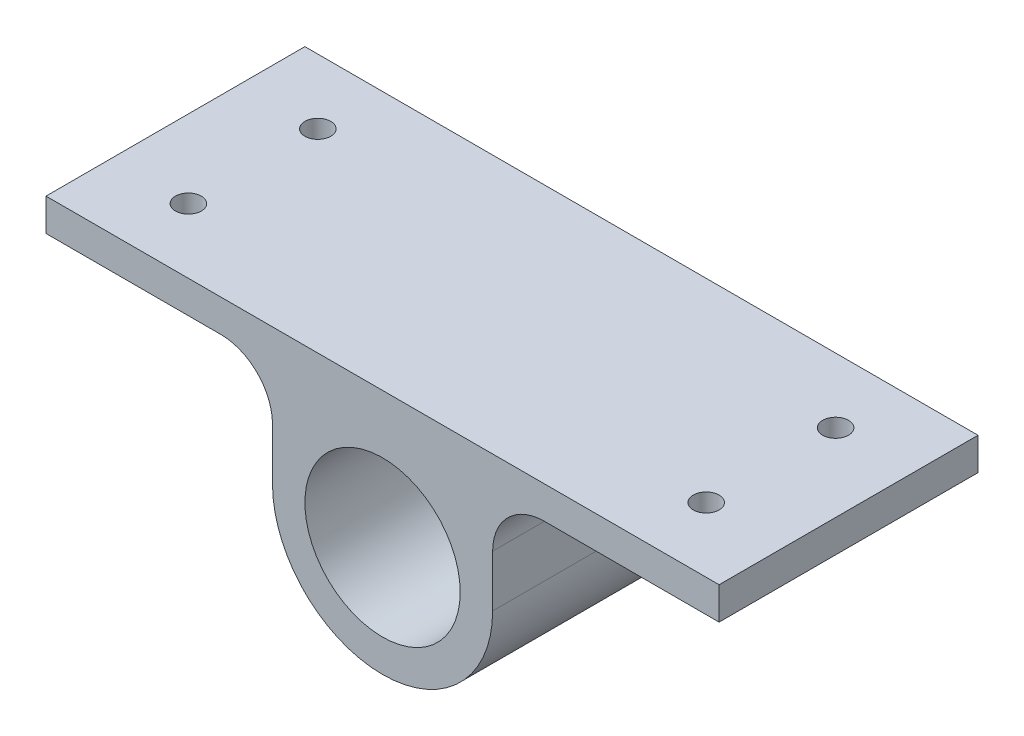
ISO-10303-21;
HEADER;
FILE_DESCRIPTION(('STEP AP214'),'2;1');
FILE_NAME('part.step','',(''),(''),'','','');
FILE_SCHEMA(('AUTOMOTIVE_DESIGN { 1 0 10303 214 1 1 1 1 }'));
ENDSEC;
DATA;
#1=APPLICATION_CONTEXT('core data for automotive mechanical design processes');
#2=APPLICATION_PROTOCOL_DEFINITION('international standard','automotive_design',2000,#1);
#3=PRODUCT_CONTEXT('',#1,'mechanical');
#4=PRODUCT('Part','Part','',(#3));
#5=PRODUCT_RELATED_PRODUCT_CATEGORY('part','',(#4));
#6=PRODUCT_DEFINITION_FORMATION('','',#4);
#7=PRODUCT_DEFINITION_CONTEXT('part definition',#1,'design');
#8=PRODUCT_DEFINITION('design','',#6,#7);
#9=PRODUCT_DEFINITION_SHAPE('','',#8);
#10=(LENGTH_UNIT() NAMED_UNIT(*) SI_UNIT(.MILLI.,.METRE.));
#11=(NAMED_UNIT(*) PLANE_ANGLE_UNIT() SI_UNIT($,.RADIAN.));
#12=(NAMED_UNIT(*) SI_UNIT($,.STERADIAN.) SOLID_ANGLE_UNIT());
#13=UNCERTAINTY_MEASURE_WITH_UNIT(LENGTH_MEASURE(1.E-05),#10,'distance_accuracy_value','');
#14=(GEOMETRIC_REPRESENTATION_CONTEXT(3) GLOBAL_UNCERTAINTY_ASSIGNED_CONTEXT((#13)) GLOBAL_UNIT_ASSIGNED_CONTEXT((#10,
#11,#12)) REPRESENTATION_CONTEXT('',''));
#15=CARTESIAN_POINT('',(0.,0.,0.));
#16=DIRECTION('',(0.,0.,1.));
#17=DIRECTION('',(1.,0.,0.));
#18=AXIS2_PLACEMENT_3D('',#15,#16,#17);
#19=CARTESIAN_POINT('',(-39.7002,12.7,31.75));
#20=DIRECTION('',(0.,0.,1.));
#21=DIRECTION('',(1.,0.,0.));
#22=AXIS2_PLACEMENT_3D('',#19,#20,#21);
#23=PLANE('',#22);
#24=DIRECTION('',(1.,0.,0.));
#25=VECTOR('',#24,1.);
#26=CARTESIAN_POINT('',(-82.55,25.4,31.75));
#27=LINE('',#26,#25);
#28=CARTESIAN_POINT('',(-82.55,25.4,31.75));
#29=VERTEX_POINT('',#28);
#30=CARTESIAN_POINT('',(-39.7002,25.4,31.75));
#31=VERTEX_POINT('',#30);
#32=EDGE_CURVE('E188',#29,#31,#27,.T.);
#33=ORIENTED_EDGE('',*,*,#32,.T.);
#34=CARTESIAN_POINT('',(-39.7002,12.7,31.75));
#35=DIRECTION('',(0.,0.,-1.));
#36=DIRECTION('',(1.,0.,0.));
#37=AXIS2_PLACEMENT_3D('',#34,#35,#36);
#38=CIRCLE('',#37,12.7);
#39=CARTESIAN_POINT('',(-27.0002,12.7,31.75));
#40=VERTEX_POINT('',#39);
#41=EDGE_CURVE('E112',#31,#40,#38,.T.);
#42=ORIENTED_EDGE('',*,*,#41,.T.);
#43=DIRECTION('',(0.,-1.,0.));
#44=VECTOR('',#43,1.);
#45=CARTESIAN_POINT('',(-27.0002,12.7,31.75));
#46=LINE('',#45,#44);
#47=CARTESIAN_POINT('',(-27.0002,0.,31.75));
#48=VERTEX_POINT('',#47);
#49=EDGE_CURVE('E217',#40,#48,#46,.T.);
#50=ORIENTED_EDGE('',*,*,#49,.T.);
#51=CARTESIAN_POINT('',(0.,0.,31.75));
#52=DIRECTION('',(0.,0.,1.));
#53=DIRECTION('',(1.,0.,0.));
#54=AXIS2_PLACEMENT_3D('',#51,#52,#53);
#55=CIRCLE('',#54,27.0002);
#56=CARTESIAN_POINT('',(27.0002,0.,31.75));
#57=VERTEX_POINT('',#56);
#58=EDGE_CURVE('E237',#48,#57,#55,.T.);
#59=ORIENTED_EDGE('',*,*,#58,.T.);
#60=DIRECTION('',(0.,1.,0.));
#61=VECTOR('',#60,1.);
#62=CARTESIAN_POINT('',(27.0002,12.7,31.75));
#63=LINE('',#62,#61);
#64=CARTESIAN_POINT('',(27.0002,12.7,31.75));
#65=VERTEX_POINT('',#64);
#66=EDGE_CURVE('E233',#57,#65,#63,.T.);
#67=ORIENTED_EDGE('',*,*,#66,.T.);
#68=CARTESIAN_POINT('',(39.7002,12.7,31.75));
#69=DIRECTION('',(0.,0.,-1.));
#70=DIRECTION('',(1.,0.,0.));
#71=AXIS2_PLACEMENT_3D('',#68,#69,#70);
#72=CIRCLE('',#71,12.7);
#73=CARTESIAN_POINT('',(39.7002,25.4,31.75));
#74=VERTEX_POINT('',#73);
#75=EDGE_CURVE('E236',#65,#74,#72,.T.);
#76=ORIENTED_EDGE('',*,*,#75,.T.);
#77=DIRECTION('',(1.,0.,0.));
#78=VECTOR('',#77,1.);
#79=CARTESIAN_POINT('',(82.55,25.4,31.75));
#80=LINE('',#79,#78);
#81=CARTESIAN_POINT('',(82.55,25.4,31.75));
#82=VERTEX_POINT('',#81);
#83=EDGE_CURVE('E137',#74,#82,#80,.T.);
#84=ORIENTED_EDGE('',*,*,#83,.T.);
#85=DIRECTION('',(0.,1.,0.));
#86=VECTOR('',#85,1.);
#87=CARTESIAN_POINT('',(82.55,33.3502,31.75));
#88=LINE('',#87,#86);
#89=CARTESIAN_POINT('',(82.55,33.3502,31.75));
#90=VERTEX_POINT('',#89);
#91=EDGE_CURVE('E131',#82,#90,#88,.T.);
#92=ORIENTED_EDGE('',*,*,#91,.T.);
#93=DIRECTION('',(-1.,0.,0.));
#94=VECTOR('',#93,1.);
#95=CARTESIAN_POINT('',(82.55,33.3502,31.75));
#96=LINE('',#95,#94);
#97=CARTESIAN_POINT('',(-82.55,33.3502,31.75));
#98=VERTEX_POINT('',#97);
#99=EDGE_CURVE('E135',#90,#98,#96,.T.);
#100=ORIENTED_EDGE('',*,*,#99,.T.);
#101=DIRECTION('',(0.,-1.,0.));
#102=VECTOR('',#101,1.);
#103=CARTESIAN_POINT('',(-82.55,33.3502,31.75));
#104=LINE('',#103,#102);
#105=EDGE_CURVE('E63',#98,#29,#104,.T.);
#106=ORIENTED_EDGE('',*,*,#105,.T.);
#107=EDGE_LOOP('',(#33,#42,#50,#59,#67,#76,#84,#92,#100,#106));
#108=FACE_BOUND('',#107,.T.);
#109=CARTESIAN_POINT('',(0.,0.,31.75));
#110=DIRECTION('',(0.,0.,1.));
#111=DIRECTION('',(1.,0.,0.));
#112=AXIS2_PLACEMENT_3D('',#109,#110,#111);
#113=CIRCLE('',#112,19.05);
#114=CARTESIAN_POINT('',(19.05,0.,31.75));
#115=VERTEX_POINT('',#114);
#116=EDGE_CURVE('E164',#115,#115,#113,.T.);
#117=ORIENTED_EDGE('',*,*,#116,.F.);
#118=EDGE_LOOP('',(#117));
#119=FACE_BOUND('',#118,.T.);
#120=ADVANCED_FACE('F45',(#108,#119),#23,.T.);
#121=CARTESIAN_POINT('',(-39.7002,12.7,-31.75));
#122=DIRECTION('',(0.,0.,1.));
#123=DIRECTION('',(1.,0.,0.));
#124=AXIS2_PLACEMENT_3D('',#121,#122,#123);
#125=PLANE('',#124);
#126=DIRECTION('',(1.,0.,0.));
#127=VECTOR('',#126,1.);
#128=CARTESIAN_POINT('',(-82.55,25.4,-31.75));
#129=LINE('',#128,#127);
#130=CARTESIAN_POINT('',(-82.55,25.4,-31.75));
#131=VERTEX_POINT('',#130);
#132=CARTESIAN_POINT('',(-39.7002,25.4,-31.75));
#133=VERTEX_POINT('',#132);
#134=EDGE_CURVE('E159',#131,#133,#129,.T.);
#135=ORIENTED_EDGE('',*,*,#134,.F.);
#136=DIRECTION('',(0.,-1.,0.));
#137=VECTOR('',#136,1.);
#138=CARTESIAN_POINT('',(-82.55,33.3502,-31.75));
#139=LINE('',#138,#137);
#140=CARTESIAN_POINT('',(-82.55,33.3502,-31.75));
#141=VERTEX_POINT('',#140);
#142=EDGE_CURVE('E104',#141,#131,#139,.T.);
#143=ORIENTED_EDGE('',*,*,#142,.F.);
#144=DIRECTION('',(-1.,0.,0.));
#145=VECTOR('',#144,1.);
#146=CARTESIAN_POINT('',(82.55,33.3502,-31.75));
#147=LINE('',#146,#145);
#148=CARTESIAN_POINT('',(82.55,33.3502,-31.75));
#149=VERTEX_POINT('',#148);
#150=EDGE_CURVE('E98',#149,#141,#147,.T.);
#151=ORIENTED_EDGE('',*,*,#150,.F.);
#152=DIRECTION('',(0.,1.,0.));
#153=VECTOR('',#152,1.);
#154=CARTESIAN_POINT('',(82.55,33.3502,-31.75));
#155=LINE('',#154,#153);
#156=CARTESIAN_POINT('',(82.55,25.4,-31.75));
#157=VERTEX_POINT('',#156);
#158=EDGE_CURVE('E146',#157,#149,#155,.T.);
#159=ORIENTED_EDGE('',*,*,#158,.F.);
#160=DIRECTION('',(1.,0.,0.));
#161=VECTOR('',#160,1.);
#162=CARTESIAN_POINT('',(82.55,25.4,-31.75));
#163=LINE('',#162,#161);
#164=CARTESIAN_POINT('',(39.7002,25.4,-31.75));
#165=VERTEX_POINT('',#164);
#166=EDGE_CURVE('E179',#165,#157,#163,.T.);
#167=ORIENTED_EDGE('',*,*,#166,.F.);
#168=CARTESIAN_POINT('',(39.7002,12.7,-31.75));
#169=DIRECTION('',(0.,0.,-1.));
#170=DIRECTION('',(1.,0.,0.));
#171=AXIS2_PLACEMENT_3D('',#168,#169,#170);
#172=CIRCLE('',#171,12.7);
#173=CARTESIAN_POINT('',(27.0002,12.7,-31.75));
#174=VERTEX_POINT('',#173);
#175=EDGE_CURVE('E176',#174,#165,#172,.T.);
#176=ORIENTED_EDGE('',*,*,#175,.F.);
#177=DIRECTION('',(0.,1.,0.));
#178=VECTOR('',#177,1.);
#179=CARTESIAN_POINT('',(27.0002,12.7,-31.75));
#180=LINE('',#179,#178);
#181=CARTESIAN_POINT('',(27.0002,0.,-31.75));
#182=VERTEX_POINT('',#181);
#183=EDGE_CURVE('E173',#182,#174,#180,.T.);
#184=ORIENTED_EDGE('',*,*,#183,.F.);
#185=CARTESIAN_POINT('',(0.,0.,-31.75));
#186=DIRECTION('',(0.,0.,1.));
#187=DIRECTION('',(1.,0.,0.));
#188=AXIS2_PLACEMENT_3D('',#185,#186,#187);
#189=CIRCLE('',#188,27.0002);
#190=CARTESIAN_POINT('',(-27.0002,0.,-31.75));
#191=VERTEX_POINT('',#190);
#192=EDGE_CURVE('E170',#191,#182,#189,.T.);
#193=ORIENTED_EDGE('',*,*,#192,.F.);
#194=DIRECTION('',(0.,-1.,0.));
#195=VECTOR('',#194,1.);
#196=CARTESIAN_POINT('',(-27.0002,12.7,-31.75));
#197=LINE('',#196,#195);
#198=CARTESIAN_POINT('',(-27.0002,12.7,-31.75));
#199=VERTEX_POINT('',#198);
#200=EDGE_CURVE('E167',#199,#191,#197,.T.);
#201=ORIENTED_EDGE('',*,*,#200,.F.);
#202=CARTESIAN_POINT('',(-39.7002,12.7,-31.75));
#203=DIRECTION('',(0.,0.,-1.));
#204=DIRECTION('',(1.,0.,0.));
#205=AXIS2_PLACEMENT_3D('',#202,#203,#204);
#206=CIRCLE('',#205,12.7);
#207=EDGE_CURVE('E163',#133,#199,#206,.T.);
#208=ORIENTED_EDGE('',*,*,#207,.F.);
#209=EDGE_LOOP('',(#135,#143,#151,#159,#167,#176,#184,#193,#201,#208));
#210=FACE_BOUND('',#209,.T.);
#211=CARTESIAN_POINT('',(0.,0.,-31.75));
#212=DIRECTION('',(0.,0.,1.));
#213=DIRECTION('',(1.,0.,0.));
#214=AXIS2_PLACEMENT_3D('',#211,#212,#213);
#215=CIRCLE('',#214,19.05);
#216=CARTESIAN_POINT('',(19.05,0.,-31.75));
#217=VERTEX_POINT('',#216);
#218=EDGE_CURVE('E251',#217,#217,#215,.T.);
#219=ORIENTED_EDGE('',*,*,#218,.T.);
#220=EDGE_LOOP('',(#219));
#221=FACE_BOUND('',#220,.T.);
#222=ADVANCED_FACE('F221',(#210,#221),#125,.F.);
#223=CARTESIAN_POINT('',(-82.55,25.4,31.75));
#224=DIRECTION('',(0.,1.,0.));
#225=DIRECTION('',(0.,0.,1.));
#226=AXIS2_PLACEMENT_3D('',#223,#224,#225);
#227=PLANE('',#226);
#228=CARTESIAN_POINT('',(-63.5,25.4,15.875));
#229=DIRECTION('',(0.,1.,0.));
#230=DIRECTION('',(0.,0.,1.));
#231=AXIS2_PLACEMENT_3D('',#228,#229,#230);
#232=CIRCLE('',#231,3.17499999999999);
#233=CARTESIAN_POINT('',(-63.5,25.4,19.05));
#234=VERTEX_POINT('',#233);
#235=EDGE_CURVE('E266',#234,#234,#232,.T.);
#236=ORIENTED_EDGE('',*,*,#235,.T.);
#237=EDGE_LOOP('',(#236));
#238=FACE_BOUND('',#237,.T.);
#239=CARTESIAN_POINT('',(-63.5,25.4,-15.875));
#240=DIRECTION('',(0.,1.,0.));
#241=DIRECTION('',(0.,0.,1.));
#242=AXIS2_PLACEMENT_3D('',#239,#240,#241);
#243=CIRCLE('',#242,3.17499999999999);
#244=CARTESIAN_POINT('',(-63.5,25.4,-12.7));
#245=VERTEX_POINT('',#244);
#246=EDGE_CURVE('E270',#245,#245,#243,.T.);
#247=ORIENTED_EDGE('',*,*,#246,.T.);
#248=EDGE_LOOP('',(#247));
#249=FACE_BOUND('',#248,.T.);
#250=ORIENTED_EDGE('',*,*,#134,.T.);
#251=DIRECTION('',(0.,0.,-1.));
#252=VECTOR('',#251,1.);
#253=CARTESIAN_POINT('',(-39.7002,25.4,31.75));
#254=LINE('',#253,#252);
#255=EDGE_CURVE('E11',#31,#133,#254,.T.);
#256=ORIENTED_EDGE('',*,*,#255,.F.);
#257=ORIENTED_EDGE('',*,*,#32,.F.);
#258=DIRECTION('',(0.,0.,-1.));
#259=VECTOR('',#258,1.);
#260=CARTESIAN_POINT('',(-82.55,25.4,31.75));
#261=LINE('',#260,#259);
#262=EDGE_CURVE('E155',#29,#131,#261,.T.);
#263=ORIENTED_EDGE('',*,*,#262,.T.);
#264=EDGE_LOOP('',(#250,#256,#257,#263));
#265=FACE_BOUND('',#264,.T.);
#266=ADVANCED_FACE('F47',(#238,#249,#265),#227,.F.);
#267=CARTESIAN_POINT('',(-39.7002,12.7,31.75));
#268=DIRECTION('',(0.,0.,-1.));
#269=DIRECTION('',(-1.,0.,0.));
#270=AXIS2_PLACEMENT_3D('',#267,#268,#269);
#271=CYLINDRICAL_SURFACE('',#270,12.7);
#272=ORIENTED_EDGE('',*,*,#207,.T.);
#273=DIRECTION('',(0.,0.,-1.));
#274=VECTOR('',#273,1.);
#275=CARTESIAN_POINT('',(-27.0002,12.7,31.75));
#276=LINE('',#275,#274);
#277=EDGE_CURVE('E55',#40,#199,#276,.T.);
#278=ORIENTED_EDGE('',*,*,#277,.F.);
#279=ORIENTED_EDGE('',*,*,#41,.F.);
#280=ORIENTED_EDGE('',*,*,#255,.T.);
#281=EDGE_LOOP('',(#272,#278,#279,#280));
#282=FACE_BOUND('',#281,.T.);
#283=ADVANCED_FACE('F310',(#282),#271,.F.);
#284=CARTESIAN_POINT('',(-27.0002,12.7,31.75));
#285=DIRECTION('',(1.,0.,0.));
#286=DIRECTION('',(0.,1.,0.));
#287=AXIS2_PLACEMENT_3D('',#284,#285,#286);
#288=PLANE('',#287);
#289=ORIENTED_EDGE('',*,*,#200,.T.);
#290=DIRECTION('',(0.,0.,-1.));
#291=VECTOR('',#290,1.);
#292=CARTESIAN_POINT('',(-27.0002,0.,31.75));
#293=LINE('',#292,#291);
#294=EDGE_CURVE('E207',#48,#191,#293,.T.);
#295=ORIENTED_EDGE('',*,*,#294,.F.);
#296=ORIENTED_EDGE('',*,*,#49,.F.);
#297=ORIENTED_EDGE('',*,*,#277,.T.);
#298=EDGE_LOOP('',(#289,#295,#296,#297));
#299=FACE_BOUND('',#298,.T.);
#300=ADVANCED_FACE('F215',(#299),#288,.F.);
#301=CARTESIAN_POINT('',(0.,0.,31.75));
#302=DIRECTION('',(0.,0.,-1.));
#303=DIRECTION('',(-1.,0.,0.));
#304=AXIS2_PLACEMENT_3D('',#301,#302,#303);
#305=CYLINDRICAL_SURFACE('',#304,27.0002);
#306=ORIENTED_EDGE('',*,*,#192,.T.);
#307=DIRECTION('',(0.,0.,-1.));
#308=VECTOR('',#307,1.);
#309=CARTESIAN_POINT('',(27.0002,0.,31.75));
#310=LINE('',#309,#308);
#311=EDGE_CURVE('E203',#57,#182,#310,.T.);
#312=ORIENTED_EDGE('',*,*,#311,.F.);
#313=ORIENTED_EDGE('',*,*,#58,.F.);
#314=ORIENTED_EDGE('',*,*,#294,.T.);
#315=EDGE_LOOP('',(#306,#312,#313,#314));
#316=FACE_BOUND('',#315,.T.);
#317=ADVANCED_FACE('F227',(#316),#305,.T.);
#318=CARTESIAN_POINT('',(27.0002,12.7,31.75));
#319=DIRECTION('',(-1.,0.,0.));
#320=DIRECTION('',(0.,-1.,0.));
#321=AXIS2_PLACEMENT_3D('',#318,#319,#320);
#322=PLANE('',#321);
#323=ORIENTED_EDGE('',*,*,#183,.T.);
#324=DIRECTION('',(0.,0.,-1.));
#325=VECTOR('',#324,1.);
#326=CARTESIAN_POINT('',(27.0002,12.7,31.75));
#327=LINE('',#326,#325);
#328=EDGE_CURVE('E199',#65,#174,#327,.T.);
#329=ORIENTED_EDGE('',*,*,#328,.F.);
#330=ORIENTED_EDGE('',*,*,#66,.F.);
#331=ORIENTED_EDGE('',*,*,#311,.T.);
#332=EDGE_LOOP('',(#323,#329,#330,#331));
#333=FACE_BOUND('',#332,.T.);
#334=ADVANCED_FACE('F231',(#333),#322,.F.);
#335=CARTESIAN_POINT('',(39.7002,12.7,31.75));
#336=DIRECTION('',(0.,0.,-1.));
#337=DIRECTION('',(-1.,0.,0.));
#338=AXIS2_PLACEMENT_3D('',#335,#336,#337);
#339=CYLINDRICAL_SURFACE('',#338,12.7);
#340=ORIENTED_EDGE('',*,*,#175,.T.);
#341=DIRECTION('',(0.,0.,-1.));
#342=VECTOR('',#341,1.);
#343=CARTESIAN_POINT('',(39.7002,25.4,31.75));
#344=LINE('',#343,#342);
#345=EDGE_CURVE('E195',#74,#165,#344,.T.);
#346=ORIENTED_EDGE('',*,*,#345,.F.);
#347=ORIENTED_EDGE('',*,*,#75,.F.);
#348=ORIENTED_EDGE('',*,*,#328,.T.);
#349=EDGE_LOOP('',(#340,#346,#347,#348));
#350=FACE_BOUND('',#349,.T.);
#351=ADVANCED_FACE('F319',(#350),#339,.F.);
#352=CARTESIAN_POINT('',(82.55,25.4,31.75));
#353=DIRECTION('',(0.,1.,0.));
#354=DIRECTION('',(-1.,0.,0.));
#355=AXIS2_PLACEMENT_3D('',#352,#353,#354);
#356=PLANE('',#355);
#357=CARTESIAN_POINT('',(63.5,25.4,-15.875));
#358=DIRECTION('',(0.,1.,0.));
#359=DIRECTION('',(-1.,0.,0.));
#360=AXIS2_PLACEMENT_3D('',#357,#358,#359);
#361=CIRCLE('',#360,3.175);
#362=CARTESIAN_POINT('',(60.325,25.4,-15.875));
#363=VERTEX_POINT('',#362);
#364=EDGE_CURVE('E255',#363,#363,#361,.T.);
#365=ORIENTED_EDGE('',*,*,#364,.T.);
#366=EDGE_LOOP('',(#365));
#367=FACE_BOUND('',#366,.T.);
#368=CARTESIAN_POINT('',(63.5,25.4,15.875));
#369=DIRECTION('',(0.,1.,0.));
#370=DIRECTION('',(-1.,0.,0.));
#371=AXIS2_PLACEMENT_3D('',#368,#369,#370);
#372=CIRCLE('',#371,3.175);
#373=CARTESIAN_POINT('',(60.325,25.4,15.875));
#374=VERTEX_POINT('',#373);
#375=EDGE_CURVE('E262',#374,#374,#372,.T.);
#376=ORIENTED_EDGE('',*,*,#375,.T.);
#377=EDGE_LOOP('',(#376));
#378=FACE_BOUND('',#377,.T.);
#379=ORIENTED_EDGE('',*,*,#166,.T.);
#380=DIRECTION('',(0.,0.,-1.));
#381=VECTOR('',#380,1.);
#382=CARTESIAN_POINT('',(82.55,25.4,31.75));
#383=LINE('',#382,#381);
#384=EDGE_CURVE('E148',#82,#157,#383,.T.);
#385=ORIENTED_EDGE('',*,*,#384,.F.);
#386=ORIENTED_EDGE('',*,*,#83,.F.);
#387=ORIENTED_EDGE('',*,*,#345,.T.);
#388=EDGE_LOOP('',(#379,#385,#386,#387));
#389=FACE_BOUND('',#388,.T.);
#390=ADVANCED_FACE('F316',(#367,#378,#389),#356,.F.);
#391=CARTESIAN_POINT('',(82.55,33.3502,31.75));
#392=DIRECTION('',(-1.,0.,0.));
#393=DIRECTION('',(0.,0.,1.));
#394=AXIS2_PLACEMENT_3D('',#391,#392,#393);
#395=PLANE('',#394);
#396=ORIENTED_EDGE('',*,*,#158,.T.);
#397=DIRECTION('',(0.,0.,-1.));
#398=VECTOR('',#397,1.);
#399=CARTESIAN_POINT('',(82.55,33.3502,31.75));
#400=LINE('',#399,#398);
#401=EDGE_CURVE('E143',#90,#149,#400,.T.);
#402=ORIENTED_EDGE('',*,*,#401,.F.);
#403=ORIENTED_EDGE('',*,*,#91,.F.);
#404=ORIENTED_EDGE('',*,*,#384,.T.);
#405=EDGE_LOOP('',(#396,#402,#403,#404));
#406=FACE_BOUND('',#405,.T.);
#407=ADVANCED_FACE('F144',(#406),#395,.F.);
#408=CARTESIAN_POINT('',(82.55,33.3502,31.75));
#409=DIRECTION('',(0.,-1.,0.));
#410=DIRECTION('',(1.,0.,0.));
#411=AXIS2_PLACEMENT_3D('',#408,#409,#410);
#412=PLANE('',#411);
#413=CARTESIAN_POINT('',(63.5,33.3502,-15.875));
#414=DIRECTION('',(0.,1.,0.));
#415=DIRECTION('',(1.,0.,0.));
#416=AXIS2_PLACEMENT_3D('',#413,#414,#415);
#417=CIRCLE('',#416,3.175);
#418=CARTESIAN_POINT('',(66.675,33.3502,-15.875));
#419=VERTEX_POINT('',#418);
#420=EDGE_CURVE('E279',#419,#419,#417,.T.);
#421=ORIENTED_EDGE('',*,*,#420,.F.);
#422=EDGE_LOOP('',(#421));
#423=FACE_BOUND('',#422,.T.);
#424=CARTESIAN_POINT('',(63.5,33.3502,15.875));
#425=DIRECTION('',(0.,1.,0.));
#426=DIRECTION('',(1.,0.,0.));
#427=AXIS2_PLACEMENT_3D('',#424,#425,#426);
#428=CIRCLE('',#427,3.175);
#429=CARTESIAN_POINT('',(66.675,33.3502,15.875));
#430=VERTEX_POINT('',#429);
#431=EDGE_CURVE('E283',#430,#430,#428,.T.);
#432=ORIENTED_EDGE('',*,*,#431,.F.);
#433=EDGE_LOOP('',(#432));
#434=FACE_BOUND('',#433,.T.);
#435=CARTESIAN_POINT('',(-63.5,33.3502,15.875));
#436=DIRECTION('',(0.,1.,0.));
#437=DIRECTION('',(-1.,0.,0.));
#438=AXIS2_PLACEMENT_3D('',#435,#436,#437);
#439=CIRCLE('',#438,3.17499999999999);
#440=CARTESIAN_POINT('',(-66.675,33.3502,15.875));
#441=VERTEX_POINT('',#440);
#442=EDGE_CURVE('E278',#441,#441,#439,.T.);
#443=ORIENTED_EDGE('',*,*,#442,.F.);
#444=EDGE_LOOP('',(#443));
#445=FACE_BOUND('',#444,.T.);
#446=CARTESIAN_POINT('',(-63.5,33.3502,-15.875));
#447=DIRECTION('',(0.,1.,0.));
#448=DIRECTION('',(-1.,0.,0.));
#449=AXIS2_PLACEMENT_3D('',#446,#447,#448);
#450=CIRCLE('',#449,3.17499999999999);
#451=CARTESIAN_POINT('',(-66.675,33.3502,-15.875));
#452=VERTEX_POINT('',#451);
#453=EDGE_CURVE('E274',#452,#452,#450,.T.);
#454=ORIENTED_EDGE('',*,*,#453,.F.);
#455=EDGE_LOOP('',(#454));
#456=FACE_BOUND('',#455,.T.);
#457=ORIENTED_EDGE('',*,*,#150,.T.);
#458=DIRECTION('',(0.,0.,-1.));
#459=VECTOR('',#458,1.);
#460=CARTESIAN_POINT('',(-82.55,33.3502,31.75));
#461=LINE('',#460,#459);
#462=EDGE_CURVE('E149',#98,#141,#461,.T.);
#463=ORIENTED_EDGE('',*,*,#462,.F.);
#464=ORIENTED_EDGE('',*,*,#99,.F.);
#465=ORIENTED_EDGE('',*,*,#401,.T.);
#466=EDGE_LOOP('',(#457,#463,#464,#465));
#467=FACE_BOUND('',#466,.T.);
#468=ADVANCED_FACE('F151',(#423,#434,#445,#456,#467),#412,.F.);
#469=CARTESIAN_POINT('',(-82.55,33.3502,31.75));
#470=DIRECTION('',(1.,0.,0.));
#471=DIRECTION('',(0.,0.,-1.));
#472=AXIS2_PLACEMENT_3D('',#469,#470,#471);
#473=PLANE('',#472);
#474=ORIENTED_EDGE('',*,*,#142,.T.);
#475=ORIENTED_EDGE('',*,*,#262,.F.);
#476=ORIENTED_EDGE('',*,*,#105,.F.);
#477=ORIENTED_EDGE('',*,*,#462,.T.);
#478=EDGE_LOOP('',(#474,#475,#476,#477));
#479=FACE_BOUND('',#478,.T.);
#480=ADVANCED_FACE('F296',(#479),#473,.F.);
#481=CARTESIAN_POINT('',(0.,0.,31.75));
#482=DIRECTION('',(0.,0.,-1.));
#483=DIRECTION('',(-1.,0.,0.));
#484=AXIS2_PLACEMENT_3D('',#481,#482,#483);
#485=CYLINDRICAL_SURFACE('',#484,19.05);
#486=ORIENTED_EDGE('',*,*,#116,.T.);
#487=EDGE_LOOP('',(#486));
#488=FACE_BOUND('',#487,.T.);
#489=ORIENTED_EDGE('',*,*,#218,.F.);
#490=EDGE_LOOP('',(#489));
#491=FACE_BOUND('',#490,.T.);
#492=ADVANCED_FACE('F304',(#488,#491),#485,.F.);
#493=CARTESIAN_POINT('',(-63.5,-27.0002,-15.875));
#494=DIRECTION('',(0.,1.,0.));
#495=DIRECTION('',(-1.,0.,0.));
#496=AXIS2_PLACEMENT_3D('',#493,#494,#495);
#497=CYLINDRICAL_SURFACE('',#496,3.17499999999999);
#498=ORIENTED_EDGE('',*,*,#453,.T.);
#499=EDGE_LOOP('',(#498));
#500=FACE_BOUND('',#499,.T.);
#501=ORIENTED_EDGE('',*,*,#246,.F.);
#502=EDGE_LOOP('',(#501));
#503=FACE_BOUND('',#502,.T.);
#504=ADVANCED_FACE('F301',(#500,#503),#497,.F.);
#505=CARTESIAN_POINT('',(-63.5,-27.0002,15.875));
#506=DIRECTION('',(0.,1.,0.));
#507=DIRECTION('',(-1.,0.,0.));
#508=AXIS2_PLACEMENT_3D('',#505,#506,#507);
#509=CYLINDRICAL_SURFACE('',#508,3.17499999999999);
#510=ORIENTED_EDGE('',*,*,#442,.T.);
#511=EDGE_LOOP('',(#510));
#512=FACE_BOUND('',#511,.T.);
#513=ORIENTED_EDGE('',*,*,#235,.F.);
#514=EDGE_LOOP('',(#513));
#515=FACE_BOUND('',#514,.T.);
#516=ADVANCED_FACE('F291',(#512,#515),#509,.F.);
#517=CARTESIAN_POINT('',(63.5,-27.0002,15.875));
#518=DIRECTION('',(0.,1.,0.));
#519=DIRECTION('',(-1.,0.,0.));
#520=AXIS2_PLACEMENT_3D('',#517,#518,#519);
#521=CYLINDRICAL_SURFACE('',#520,3.175);
#522=ORIENTED_EDGE('',*,*,#431,.T.);
#523=EDGE_LOOP('',(#522));
#524=FACE_BOUND('',#523,.T.);
#525=ORIENTED_EDGE('',*,*,#375,.F.);
#526=EDGE_LOOP('',(#525));
#527=FACE_BOUND('',#526,.T.);
#528=ADVANCED_FACE('F383',(#524,#527),#521,.F.);
#529=CARTESIAN_POINT('',(63.5,-27.0002,-15.875));
#530=DIRECTION('',(0.,1.,0.));
#531=DIRECTION('',(-1.,0.,0.));
#532=AXIS2_PLACEMENT_3D('',#529,#530,#531);
#533=CYLINDRICAL_SURFACE('',#532,3.175);
#534=ORIENTED_EDGE('',*,*,#420,.T.);
#535=EDGE_LOOP('',(#534));
#536=FACE_BOUND('',#535,.T.);
#537=ORIENTED_EDGE('',*,*,#364,.F.);
#538=EDGE_LOOP('',(#537));
#539=FACE_BOUND('',#538,.T.);
#540=ADVANCED_FACE('F391',(#536,#539),#533,.F.);
#541=CLOSED_SHELL('',(#120,#222,#266,#283,#300,#317,#334,#351,#390,#407,#468,#480,#492,#504,
#516,#528,#540));
#542=MANIFOLD_SOLID_BREP('B2',#541);
#543=ADVANCED_BREP_SHAPE_REPRESENTATION('',(#18,#542),#14);
#544=SHAPE_DEFINITION_REPRESENTATION(#9,#543);
ENDSEC;
END-ISO-10303-21;
